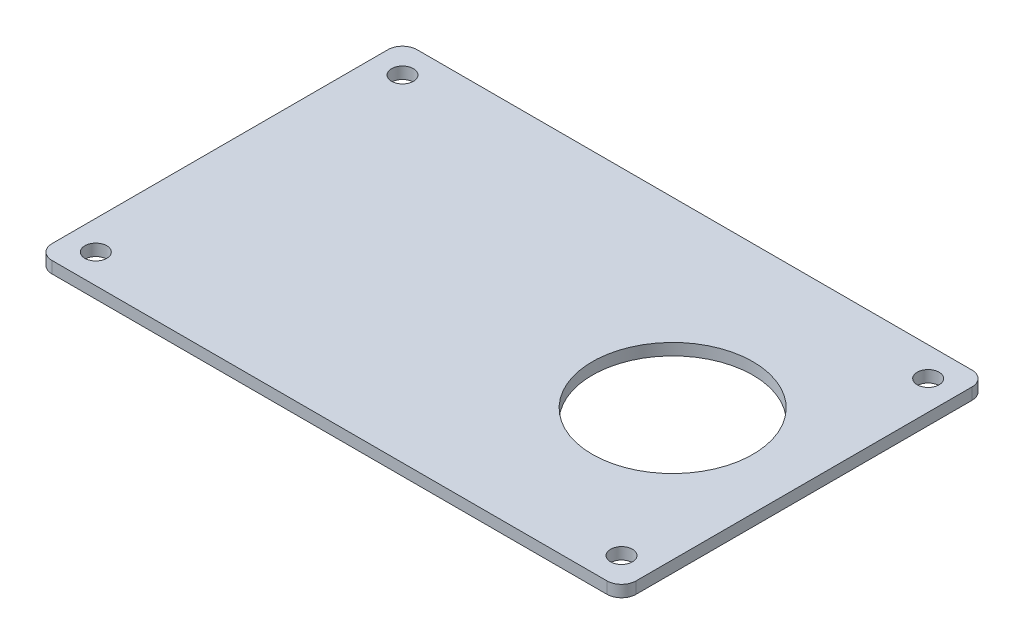
ISO-10303-21;
HEADER;
FILE_DESCRIPTION(('STEP AP214'),'2;1');
FILE_NAME('part.step','',(''),(''),'','','');
FILE_SCHEMA(('AUTOMOTIVE_DESIGN { 1 0 10303 214 1 1 1 1 }'));
ENDSEC;
DATA;
#1=APPLICATION_CONTEXT('core data for automotive mechanical design processes');
#2=APPLICATION_PROTOCOL_DEFINITION('international standard','automotive_design',2000,#1);
#3=PRODUCT_CONTEXT('',#1,'mechanical');
#4=PRODUCT('Part','Part','',(#3));
#5=PRODUCT_RELATED_PRODUCT_CATEGORY('part','',(#4));
#6=PRODUCT_DEFINITION_FORMATION('','',#4);
#7=PRODUCT_DEFINITION_CONTEXT('part definition',#1,'design');
#8=PRODUCT_DEFINITION('design','',#6,#7);
#9=PRODUCT_DEFINITION_SHAPE('','',#8);
#10=(LENGTH_UNIT() NAMED_UNIT(*) SI_UNIT(.MILLI.,.METRE.));
#11=(NAMED_UNIT(*) PLANE_ANGLE_UNIT() SI_UNIT($,.RADIAN.));
#12=(NAMED_UNIT(*) SI_UNIT($,.STERADIAN.) SOLID_ANGLE_UNIT());
#13=UNCERTAINTY_MEASURE_WITH_UNIT(LENGTH_MEASURE(1.E-05),#10,'distance_accuracy_value','');
#14=(GEOMETRIC_REPRESENTATION_CONTEXT(3) GLOBAL_UNCERTAINTY_ASSIGNED_CONTEXT((#13)) GLOBAL_UNIT_ASSIGNED_CONTEXT((#10,
#11,#12)) REPRESENTATION_CONTEXT('',''));
#15=CARTESIAN_POINT('',(0.,0.,0.));
#16=DIRECTION('',(0.,0.,1.));
#17=DIRECTION('',(1.,0.,0.));
#18=AXIS2_PLACEMENT_3D('',#15,#16,#17);
#19=CARTESIAN_POINT('',(0.,1.6,0.));
#20=DIRECTION('',(0.,-1.,0.));
#21=DIRECTION('',(0.,0.,-1.));
#22=AXIS2_PLACEMENT_3D('',#19,#20,#21);
#23=PLANE('',#22);
#24=DIRECTION('',(-1.,0.,0.));
#25=VECTOR('',#24,1.);
#26=CARTESIAN_POINT('',(-40.,1.6,-25.));
#27=LINE('',#26,#25);
#28=CARTESIAN_POINT('',(38.,1.6,-25.));
#29=VERTEX_POINT('',#28);
#30=CARTESIAN_POINT('',(-38.,1.6,-25.));
#31=VERTEX_POINT('',#30);
#32=EDGE_CURVE('E179',#29,#31,#27,.T.);
#33=ORIENTED_EDGE('',*,*,#32,.T.);
#34=CARTESIAN_POINT('',(-38.,1.6,-23.));
#35=DIRECTION('',(0.,-1.,0.));
#36=DIRECTION('',(0.,0.,-1.));
#37=AXIS2_PLACEMENT_3D('',#34,#35,#36);
#38=CIRCLE('',#37,2.);
#39=CARTESIAN_POINT('',(-40.,1.6,-23.));
#40=VERTEX_POINT('',#39);
#41=EDGE_CURVE('E156',#31,#40,#38,.F.);
#42=ORIENTED_EDGE('',*,*,#41,.T.);
#43=DIRECTION('',(0.,0.,1.));
#44=VECTOR('',#43,1.);
#45=CARTESIAN_POINT('',(-40.,1.6,25.));
#46=LINE('',#45,#44);
#47=CARTESIAN_POINT('',(-40.,1.6,23.));
#48=VERTEX_POINT('',#47);
#49=EDGE_CURVE('E126',#40,#48,#46,.T.);
#50=ORIENTED_EDGE('',*,*,#49,.T.);
#51=CARTESIAN_POINT('',(-38.,1.6,23.));
#52=DIRECTION('',(0.,-1.,0.));
#53=DIRECTION('',(0.,0.,-1.));
#54=AXIS2_PLACEMENT_3D('',#51,#52,#53);
#55=CIRCLE('',#54,2.);
#56=CARTESIAN_POINT('',(-38.,1.6,25.));
#57=VERTEX_POINT('',#56);
#58=EDGE_CURVE('E63',#48,#57,#55,.F.);
#59=ORIENTED_EDGE('',*,*,#58,.T.);
#60=DIRECTION('',(1.,0.,0.));
#61=VECTOR('',#60,1.);
#62=CARTESIAN_POINT('',(-40.,1.6,25.));
#63=LINE('',#62,#61);
#64=CARTESIAN_POINT('',(38.,1.6,25.));
#65=VERTEX_POINT('',#64);
#66=EDGE_CURVE('E142',#57,#65,#63,.T.);
#67=ORIENTED_EDGE('',*,*,#66,.T.);
#68=CARTESIAN_POINT('',(38.,1.6,23.));
#69=DIRECTION('',(0.,-1.,0.));
#70=DIRECTION('',(0.,0.,-1.));
#71=AXIS2_PLACEMENT_3D('',#68,#69,#70);
#72=CIRCLE('',#71,2.);
#73=CARTESIAN_POINT('',(40.,1.6,23.));
#74=VERTEX_POINT('',#73);
#75=EDGE_CURVE('E151',#65,#74,#72,.F.);
#76=ORIENTED_EDGE('',*,*,#75,.T.);
#77=DIRECTION('',(0.,0.,-1.));
#78=VECTOR('',#77,1.);
#79=CARTESIAN_POINT('',(40.,1.6,25.));
#80=LINE('',#79,#78);
#81=CARTESIAN_POINT('',(40.,1.6,-23.));
#82=VERTEX_POINT('',#81);
#83=EDGE_CURVE('E136',#74,#82,#80,.T.);
#84=ORIENTED_EDGE('',*,*,#83,.T.);
#85=CARTESIAN_POINT('',(38.,1.6,-23.));
#86=DIRECTION('',(0.,-1.,0.));
#87=DIRECTION('',(0.,0.,-1.));
#88=AXIS2_PLACEMENT_3D('',#85,#86,#87);
#89=CIRCLE('',#88,2.);
#90=EDGE_CURVE('E153',#82,#29,#89,.F.);
#91=ORIENTED_EDGE('',*,*,#90,.T.);
#92=EDGE_LOOP('',(#33,#42,#50,#59,#67,#76,#84,#91));
#93=FACE_BOUND('',#92,.T.);
#94=CARTESIAN_POINT('',(36.,1.6,-21.));
#95=DIRECTION('',(0.,1.,0.));
#96=DIRECTION('',(0.,0.,1.));
#97=AXIS2_PLACEMENT_3D('',#94,#95,#96);
#98=CIRCLE('',#97,1.5);
#99=CARTESIAN_POINT('',(36.,1.6,-19.5));
#100=VERTEX_POINT('',#99);
#101=EDGE_CURVE('E172',#100,#100,#98,.T.);
#102=ORIENTED_EDGE('',*,*,#101,.F.);
#103=EDGE_LOOP('',(#102));
#104=FACE_BOUND('',#103,.T.);
#105=CARTESIAN_POINT('',(36.,1.6,21.));
#106=DIRECTION('',(0.,1.,0.));
#107=DIRECTION('',(0.,0.,-1.));
#108=AXIS2_PLACEMENT_3D('',#105,#106,#107);
#109=CIRCLE('',#108,1.5);
#110=CARTESIAN_POINT('',(36.,1.6,19.5));
#111=VERTEX_POINT('',#110);
#112=EDGE_CURVE('E184',#111,#111,#109,.T.);
#113=ORIENTED_EDGE('',*,*,#112,.F.);
#114=EDGE_LOOP('',(#113));
#115=FACE_BOUND('',#114,.T.);
#116=CARTESIAN_POINT('',(-36.,1.6,21.));
#117=DIRECTION('',(0.,1.,0.));
#118=DIRECTION('',(0.,0.,1.));
#119=AXIS2_PLACEMENT_3D('',#116,#117,#118);
#120=CIRCLE('',#119,1.5);
#121=CARTESIAN_POINT('',(-36.,1.6,22.5));
#122=VERTEX_POINT('',#121);
#123=EDGE_CURVE('E189',#122,#122,#120,.T.);
#124=ORIENTED_EDGE('',*,*,#123,.F.);
#125=EDGE_LOOP('',(#124));
#126=FACE_BOUND('',#125,.T.);
#127=CARTESIAN_POINT('',(-36.,1.6,-21.));
#128=DIRECTION('',(0.,1.,0.));
#129=DIRECTION('',(0.,0.,-1.));
#130=AXIS2_PLACEMENT_3D('',#127,#128,#129);
#131=CIRCLE('',#130,1.5);
#132=CARTESIAN_POINT('',(-36.,1.6,-22.5));
#133=VERTEX_POINT('',#132);
#134=EDGE_CURVE('E195',#133,#133,#131,.T.);
#135=ORIENTED_EDGE('',*,*,#134,.F.);
#136=EDGE_LOOP('',(#135));
#137=FACE_BOUND('',#136,.T.);
#138=CARTESIAN_POINT('',(22.,1.6,0.));
#139=DIRECTION('',(0.,1.,0.));
#140=DIRECTION('',(0.,0.,1.));
#141=AXIS2_PLACEMENT_3D('',#138,#139,#140);
#142=CIRCLE('',#141,11.);
#143=CARTESIAN_POINT('',(22.,1.6,11.));
#144=VERTEX_POINT('',#143);
#145=EDGE_CURVE('E201',#144,#144,#142,.T.);
#146=ORIENTED_EDGE('',*,*,#145,.F.);
#147=EDGE_LOOP('',(#146));
#148=FACE_BOUND('',#147,.T.);
#149=ADVANCED_FACE('F41',(#93,#104,#115,#126,#137,#148),#23,.F.);
#150=CARTESIAN_POINT('',(0.,0.,0.));
#151=DIRECTION('',(0.,-1.,0.));
#152=DIRECTION('',(0.,0.,-1.));
#153=AXIS2_PLACEMENT_3D('',#150,#151,#152);
#154=PLANE('',#153);
#155=CARTESIAN_POINT('',(-36.,0.,-21.));
#156=DIRECTION('',(0.,1.,0.));
#157=DIRECTION('',(0.,0.,-1.));
#158=AXIS2_PLACEMENT_3D('',#155,#156,#157);
#159=CIRCLE('',#158,1.5);
#160=CARTESIAN_POINT('',(-36.,0.,-22.5));
#161=VERTEX_POINT('',#160);
#162=EDGE_CURVE('E198',#161,#161,#159,.T.);
#163=ORIENTED_EDGE('',*,*,#162,.T.);
#164=EDGE_LOOP('',(#163));
#165=FACE_BOUND('',#164,.T.);
#166=CARTESIAN_POINT('',(36.,0.,21.));
#167=DIRECTION('',(0.,1.,0.));
#168=DIRECTION('',(0.,0.,-1.));
#169=AXIS2_PLACEMENT_3D('',#166,#167,#168);
#170=CIRCLE('',#169,1.5);
#171=CARTESIAN_POINT('',(36.,0.,19.5));
#172=VERTEX_POINT('',#171);
#173=EDGE_CURVE('E186',#172,#172,#170,.T.);
#174=ORIENTED_EDGE('',*,*,#173,.T.);
#175=EDGE_LOOP('',(#174));
#176=FACE_BOUND('',#175,.T.);
#177=DIRECTION('',(0.,0.,1.));
#178=VECTOR('',#177,1.);
#179=CARTESIAN_POINT('',(-40.,0.,25.));
#180=LINE('',#179,#178);
#181=CARTESIAN_POINT('',(-40.,0.,-23.));
#182=VERTEX_POINT('',#181);
#183=CARTESIAN_POINT('',(-40.,0.,23.));
#184=VERTEX_POINT('',#183);
#185=EDGE_CURVE('E124',#182,#184,#180,.T.);
#186=ORIENTED_EDGE('',*,*,#185,.F.);
#187=CARTESIAN_POINT('',(-38.,0.,-23.));
#188=DIRECTION('',(0.,-1.,0.));
#189=DIRECTION('',(0.,0.,-1.));
#190=AXIS2_PLACEMENT_3D('',#187,#188,#189);
#191=CIRCLE('',#190,2.);
#192=CARTESIAN_POINT('',(-38.,0.,-25.));
#193=VERTEX_POINT('',#192);
#194=EDGE_CURVE('E107',#182,#193,#191,.T.);
#195=ORIENTED_EDGE('',*,*,#194,.T.);
#196=DIRECTION('',(-1.,0.,0.));
#197=VECTOR('',#196,1.);
#198=CARTESIAN_POINT('',(-40.,0.,-25.));
#199=LINE('',#198,#197);
#200=CARTESIAN_POINT('',(38.,0.,-25.));
#201=VERTEX_POINT('',#200);
#202=EDGE_CURVE('E134',#201,#193,#199,.T.);
#203=ORIENTED_EDGE('',*,*,#202,.F.);
#204=CARTESIAN_POINT('',(38.,0.,-23.));
#205=DIRECTION('',(0.,-1.,0.));
#206=DIRECTION('',(0.,0.,-1.));
#207=AXIS2_PLACEMENT_3D('',#204,#205,#206);
#208=CIRCLE('',#207,2.);
#209=CARTESIAN_POINT('',(40.,0.,-23.));
#210=VERTEX_POINT('',#209);
#211=EDGE_CURVE('E145',#201,#210,#208,.T.);
#212=ORIENTED_EDGE('',*,*,#211,.T.);
#213=DIRECTION('',(0.,0.,-1.));
#214=VECTOR('',#213,1.);
#215=CARTESIAN_POINT('',(40.,0.,25.));
#216=LINE('',#215,#214);
#217=CARTESIAN_POINT('',(40.,0.,23.));
#218=VERTEX_POINT('',#217);
#219=EDGE_CURVE('E138',#218,#210,#216,.T.);
#220=ORIENTED_EDGE('',*,*,#219,.F.);
#221=CARTESIAN_POINT('',(38.,0.,23.));
#222=DIRECTION('',(0.,-1.,0.));
#223=DIRECTION('',(0.,0.,-1.));
#224=AXIS2_PLACEMENT_3D('',#221,#222,#223);
#225=CIRCLE('',#224,2.);
#226=CARTESIAN_POINT('',(38.,0.,25.));
#227=VERTEX_POINT('',#226);
#228=EDGE_CURVE('E127',#218,#227,#225,.T.);
#229=ORIENTED_EDGE('',*,*,#228,.T.);
#230=DIRECTION('',(1.,0.,0.));
#231=VECTOR('',#230,1.);
#232=CARTESIAN_POINT('',(-40.,0.,25.));
#233=LINE('',#232,#231);
#234=CARTESIAN_POINT('',(-38.,0.,25.));
#235=VERTEX_POINT('',#234);
#236=EDGE_CURVE('E133',#235,#227,#233,.T.);
#237=ORIENTED_EDGE('',*,*,#236,.F.);
#238=CARTESIAN_POINT('',(-38.,0.,23.));
#239=DIRECTION('',(0.,-1.,0.));
#240=DIRECTION('',(0.,0.,-1.));
#241=AXIS2_PLACEMENT_3D('',#238,#239,#240);
#242=CIRCLE('',#241,2.);
#243=EDGE_CURVE('E118',#235,#184,#242,.T.);
#244=ORIENTED_EDGE('',*,*,#243,.T.);
#245=EDGE_LOOP('',(#186,#195,#203,#212,#220,#229,#237,#244));
#246=FACE_BOUND('',#245,.T.);
#247=CARTESIAN_POINT('',(36.,0.,-21.));
#248=DIRECTION('',(0.,1.,0.));
#249=DIRECTION('',(0.,0.,1.));
#250=AXIS2_PLACEMENT_3D('',#247,#248,#249);
#251=CIRCLE('',#250,1.5);
#252=CARTESIAN_POINT('',(36.,0.,-19.5));
#253=VERTEX_POINT('',#252);
#254=EDGE_CURVE('E174',#253,#253,#251,.T.);
#255=ORIENTED_EDGE('',*,*,#254,.T.);
#256=EDGE_LOOP('',(#255));
#257=FACE_BOUND('',#256,.T.);
#258=CARTESIAN_POINT('',(-36.,0.,21.));
#259=DIRECTION('',(0.,1.,0.));
#260=DIRECTION('',(0.,0.,1.));
#261=AXIS2_PLACEMENT_3D('',#258,#259,#260);
#262=CIRCLE('',#261,1.5);
#263=CARTESIAN_POINT('',(-36.,0.,22.5));
#264=VERTEX_POINT('',#263);
#265=EDGE_CURVE('E192',#264,#264,#262,.T.);
#266=ORIENTED_EDGE('',*,*,#265,.T.);
#267=EDGE_LOOP('',(#266));
#268=FACE_BOUND('',#267,.T.);
#269=CARTESIAN_POINT('',(22.,0.,0.));
#270=DIRECTION('',(0.,1.,0.));
#271=DIRECTION('',(0.,0.,1.));
#272=AXIS2_PLACEMENT_3D('',#269,#270,#271);
#273=CIRCLE('',#272,11.);
#274=CARTESIAN_POINT('',(22.,0.,11.));
#275=VERTEX_POINT('',#274);
#276=EDGE_CURVE('E204',#275,#275,#273,.T.);
#277=ORIENTED_EDGE('',*,*,#276,.T.);
#278=EDGE_LOOP('',(#277));
#279=FACE_BOUND('',#278,.T.);
#280=ADVANCED_FACE('F130',(#165,#176,#246,#257,#268,#279),#154,.T.);
#281=CARTESIAN_POINT('',(40.,1.6,25.));
#282=DIRECTION('',(-1.,0.,0.));
#283=DIRECTION('',(0.,0.,1.));
#284=AXIS2_PLACEMENT_3D('',#281,#282,#283);
#285=PLANE('',#284);
#286=ORIENTED_EDGE('',*,*,#219,.T.);
#287=DIRECTION('',(0.,-1.,0.));
#288=VECTOR('',#287,1.);
#289=CARTESIAN_POINT('',(40.,1.6,-23.));
#290=LINE('',#289,#288);
#291=EDGE_CURVE('E11',#210,#82,#290,.F.);
#292=ORIENTED_EDGE('',*,*,#291,.T.);
#293=ORIENTED_EDGE('',*,*,#83,.F.);
#294=DIRECTION('',(0.,-1.,0.));
#295=VECTOR('',#294,1.);
#296=CARTESIAN_POINT('',(40.,1.6,23.));
#297=LINE('',#296,#295);
#298=EDGE_CURVE('E49',#74,#218,#297,.T.);
#299=ORIENTED_EDGE('',*,*,#298,.T.);
#300=EDGE_LOOP('',(#286,#292,#293,#299));
#301=FACE_BOUND('',#300,.T.);
#302=ADVANCED_FACE('F167',(#301),#285,.F.);
#303=CARTESIAN_POINT('',(-40.,1.6,-25.));
#304=DIRECTION('',(0.,0.,1.));
#305=DIRECTION('',(1.,0.,0.));
#306=AXIS2_PLACEMENT_3D('',#303,#304,#305);
#307=PLANE('',#306);
#308=ORIENTED_EDGE('',*,*,#202,.T.);
#309=DIRECTION('',(0.,-1.,0.));
#310=VECTOR('',#309,1.);
#311=CARTESIAN_POINT('',(-38.,1.6,-25.));
#312=LINE('',#311,#310);
#313=EDGE_CURVE('E112',#193,#31,#312,.F.);
#314=ORIENTED_EDGE('',*,*,#313,.T.);
#315=ORIENTED_EDGE('',*,*,#32,.F.);
#316=DIRECTION('',(0.,-1.,0.));
#317=VECTOR('',#316,1.);
#318=CARTESIAN_POINT('',(38.,1.6,-25.));
#319=LINE('',#318,#317);
#320=EDGE_CURVE('E117',#29,#201,#319,.T.);
#321=ORIENTED_EDGE('',*,*,#320,.T.);
#322=EDGE_LOOP('',(#308,#314,#315,#321));
#323=FACE_BOUND('',#322,.T.);
#324=ADVANCED_FACE('F231',(#323),#307,.F.);
#325=CARTESIAN_POINT('',(-40.,1.6,25.));
#326=DIRECTION('',(1.,0.,0.));
#327=DIRECTION('',(0.,0.,-1.));
#328=AXIS2_PLACEMENT_3D('',#325,#326,#327);
#329=PLANE('',#328);
#330=ORIENTED_EDGE('',*,*,#49,.F.);
#331=DIRECTION('',(0.,-1.,0.));
#332=VECTOR('',#331,1.);
#333=CARTESIAN_POINT('',(-40.,1.6,-23.));
#334=LINE('',#333,#332);
#335=EDGE_CURVE('E111',#40,#182,#334,.T.);
#336=ORIENTED_EDGE('',*,*,#335,.T.);
#337=ORIENTED_EDGE('',*,*,#185,.T.);
#338=DIRECTION('',(0.,-1.,0.));
#339=VECTOR('',#338,1.);
#340=CARTESIAN_POINT('',(-40.,1.6,23.));
#341=LINE('',#340,#339);
#342=EDGE_CURVE('E128',#184,#48,#341,.F.);
#343=ORIENTED_EDGE('',*,*,#342,.T.);
#344=EDGE_LOOP('',(#330,#336,#337,#343));
#345=FACE_BOUND('',#344,.T.);
#346=ADVANCED_FACE('F123',(#345),#329,.F.);
#347=CARTESIAN_POINT('',(-40.,1.6,25.));
#348=DIRECTION('',(0.,0.,-1.));
#349=DIRECTION('',(-1.,0.,0.));
#350=AXIS2_PLACEMENT_3D('',#347,#348,#349);
#351=PLANE('',#350);
#352=ORIENTED_EDGE('',*,*,#66,.F.);
#353=DIRECTION('',(0.,-1.,0.));
#354=VECTOR('',#353,1.);
#355=CARTESIAN_POINT('',(-38.,1.6,25.));
#356=LINE('',#355,#354);
#357=EDGE_CURVE('E159',#57,#235,#356,.T.);
#358=ORIENTED_EDGE('',*,*,#357,.T.);
#359=ORIENTED_EDGE('',*,*,#236,.T.);
#360=DIRECTION('',(0.,-1.,0.));
#361=VECTOR('',#360,1.);
#362=CARTESIAN_POINT('',(38.,1.6,25.));
#363=LINE('',#362,#361);
#364=EDGE_CURVE('E56',#227,#65,#363,.F.);
#365=ORIENTED_EDGE('',*,*,#364,.T.);
#366=EDGE_LOOP('',(#352,#358,#359,#365));
#367=FACE_BOUND('',#366,.T.);
#368=ADVANCED_FACE('F226',(#367),#351,.F.);
#369=CARTESIAN_POINT('',(36.,1.6,-21.));
#370=DIRECTION('',(0.,-1.,0.));
#371=DIRECTION('',(0.,0.,-1.));
#372=AXIS2_PLACEMENT_3D('',#369,#370,#371);
#373=CYLINDRICAL_SURFACE('',#372,1.5);
#374=ORIENTED_EDGE('',*,*,#101,.T.);
#375=EDGE_LOOP('',(#374));
#376=FACE_BOUND('',#375,.T.);
#377=ORIENTED_EDGE('',*,*,#254,.F.);
#378=EDGE_LOOP('',(#377));
#379=FACE_BOUND('',#378,.T.);
#380=ADVANCED_FACE('F223',(#376,#379),#373,.F.);
#381=CARTESIAN_POINT('',(36.,1.6,21.));
#382=DIRECTION('',(0.,-1.,0.));
#383=DIRECTION('',(0.,0.,-1.));
#384=AXIS2_PLACEMENT_3D('',#381,#382,#383);
#385=CYLINDRICAL_SURFACE('',#384,1.5);
#386=ORIENTED_EDGE('',*,*,#112,.T.);
#387=EDGE_LOOP('',(#386));
#388=FACE_BOUND('',#387,.T.);
#389=ORIENTED_EDGE('',*,*,#173,.F.);
#390=EDGE_LOOP('',(#389));
#391=FACE_BOUND('',#390,.T.);
#392=ADVANCED_FACE('F298',(#388,#391),#385,.F.);
#393=CARTESIAN_POINT('',(-36.,1.6,21.));
#394=DIRECTION('',(0.,-1.,0.));
#395=DIRECTION('',(0.,0.,-1.));
#396=AXIS2_PLACEMENT_3D('',#393,#394,#395);
#397=CYLINDRICAL_SURFACE('',#396,1.5);
#398=ORIENTED_EDGE('',*,*,#123,.T.);
#399=EDGE_LOOP('',(#398));
#400=FACE_BOUND('',#399,.T.);
#401=ORIENTED_EDGE('',*,*,#265,.F.);
#402=EDGE_LOOP('',(#401));
#403=FACE_BOUND('',#402,.T.);
#404=ADVANCED_FACE('F288',(#400,#403),#397,.F.);
#405=CARTESIAN_POINT('',(-36.,1.6,-21.));
#406=DIRECTION('',(0.,-1.,0.));
#407=DIRECTION('',(0.,0.,-1.));
#408=AXIS2_PLACEMENT_3D('',#405,#406,#407);
#409=CYLINDRICAL_SURFACE('',#408,1.5);
#410=ORIENTED_EDGE('',*,*,#134,.T.);
#411=EDGE_LOOP('',(#410));
#412=FACE_BOUND('',#411,.T.);
#413=ORIENTED_EDGE('',*,*,#162,.F.);
#414=EDGE_LOOP('',(#413));
#415=FACE_BOUND('',#414,.T.);
#416=ADVANCED_FACE('F279',(#412,#415),#409,.F.);
#417=CARTESIAN_POINT('',(22.,1.6,0.));
#418=DIRECTION('',(0.,-1.,0.));
#419=DIRECTION('',(0.,0.,-1.));
#420=AXIS2_PLACEMENT_3D('',#417,#418,#419);
#421=CYLINDRICAL_SURFACE('',#420,11.);
#422=ORIENTED_EDGE('',*,*,#145,.T.);
#423=EDGE_LOOP('',(#422));
#424=FACE_BOUND('',#423,.T.);
#425=ORIENTED_EDGE('',*,*,#276,.F.);
#426=EDGE_LOOP('',(#425));
#427=FACE_BOUND('',#426,.T.);
#428=ADVANCED_FACE('F210',(#424,#427),#421,.F.);
#429=CARTESIAN_POINT('',(-38.,1.6,-23.));
#430=DIRECTION('',(0.,-1.,0.));
#431=DIRECTION('',(0.,0.,-1.));
#432=AXIS2_PLACEMENT_3D('',#429,#430,#431);
#433=CYLINDRICAL_SURFACE('',#432,2.);
#434=ORIENTED_EDGE('',*,*,#41,.F.);
#435=ORIENTED_EDGE('',*,*,#313,.F.);
#436=ORIENTED_EDGE('',*,*,#194,.F.);
#437=ORIENTED_EDGE('',*,*,#335,.F.);
#438=EDGE_LOOP('',(#434,#435,#436,#437));
#439=FACE_BOUND('',#438,.T.);
#440=ADVANCED_FACE('F110',(#439),#433,.T.);
#441=CARTESIAN_POINT('',(-38.,1.6,23.));
#442=DIRECTION('',(0.,-1.,0.));
#443=DIRECTION('',(0.,0.,-1.));
#444=AXIS2_PLACEMENT_3D('',#441,#442,#443);
#445=CYLINDRICAL_SURFACE('',#444,2.);
#446=ORIENTED_EDGE('',*,*,#58,.F.);
#447=ORIENTED_EDGE('',*,*,#342,.F.);
#448=ORIENTED_EDGE('',*,*,#243,.F.);
#449=ORIENTED_EDGE('',*,*,#357,.F.);
#450=EDGE_LOOP('',(#446,#447,#448,#449));
#451=FACE_BOUND('',#450,.T.);
#452=ADVANCED_FACE('F239',(#451),#445,.T.);
#453=CARTESIAN_POINT('',(38.,1.6,-23.));
#454=DIRECTION('',(0.,-1.,0.));
#455=DIRECTION('',(0.,0.,-1.));
#456=AXIS2_PLACEMENT_3D('',#453,#454,#455);
#457=CYLINDRICAL_SURFACE('',#456,2.);
#458=ORIENTED_EDGE('',*,*,#90,.F.);
#459=ORIENTED_EDGE('',*,*,#291,.F.);
#460=ORIENTED_EDGE('',*,*,#211,.F.);
#461=ORIENTED_EDGE('',*,*,#320,.F.);
#462=EDGE_LOOP('',(#458,#459,#460,#461));
#463=FACE_BOUND('',#462,.T.);
#464=ADVANCED_FACE('F241',(#463),#457,.T.);
#465=CARTESIAN_POINT('',(38.,1.6,23.));
#466=DIRECTION('',(0.,-1.,0.));
#467=DIRECTION('',(0.,0.,-1.));
#468=AXIS2_PLACEMENT_3D('',#465,#466,#467);
#469=CYLINDRICAL_SURFACE('',#468,2.);
#470=ORIENTED_EDGE('',*,*,#75,.F.);
#471=ORIENTED_EDGE('',*,*,#364,.F.);
#472=ORIENTED_EDGE('',*,*,#228,.F.);
#473=ORIENTED_EDGE('',*,*,#298,.F.);
#474=EDGE_LOOP('',(#470,#471,#472,#473));
#475=FACE_BOUND('',#474,.T.);
#476=ADVANCED_FACE('F43',(#475),#469,.T.);
#477=CLOSED_SHELL('',(#149,#280,#302,#324,#346,#368,#380,#392,#404,#416,#428,#440,#452,#464,#476));
#478=MANIFOLD_SOLID_BREP('B2',#477);
#479=ADVANCED_BREP_SHAPE_REPRESENTATION('',(#18,#478),#14);
#480=SHAPE_DEFINITION_REPRESENTATION(#9,#479);
ENDSEC;
END-ISO-10303-21;
